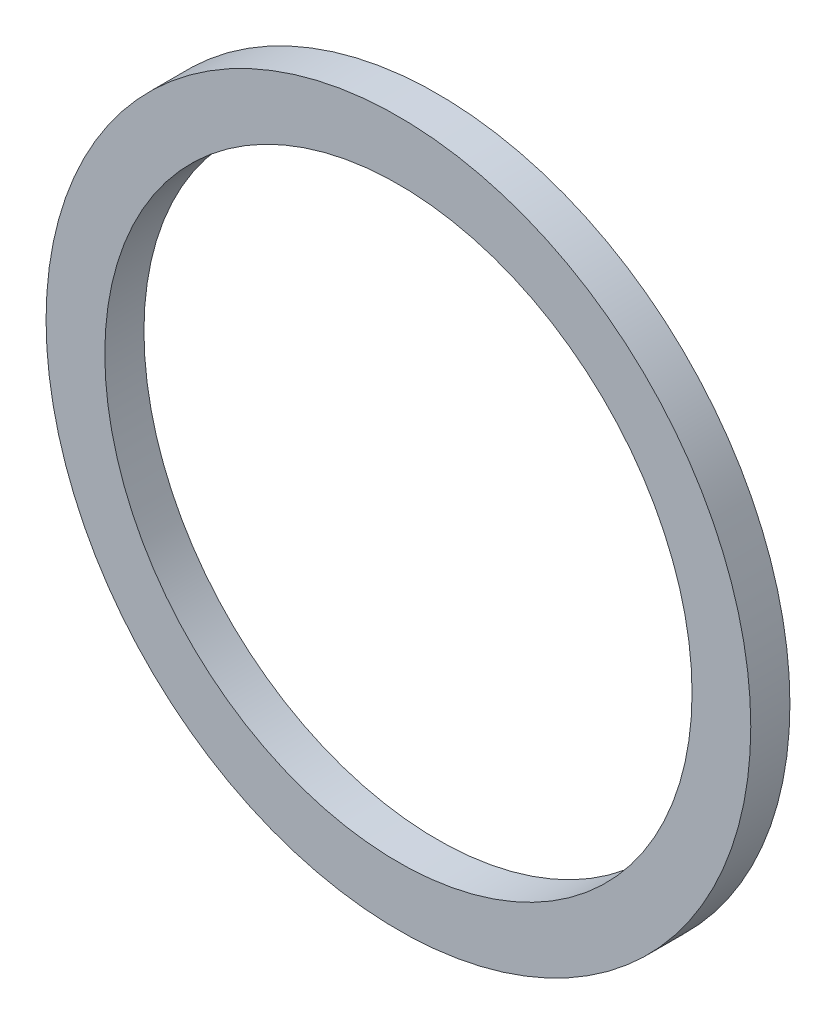
ISO-10303-21;
HEADER;
FILE_DESCRIPTION(('STEP AP214'),'2;1');
FILE_NAME('part.step','',(''),(''),'','','');
FILE_SCHEMA(('AUTOMOTIVE_DESIGN { 1 0 10303 214 1 1 1 1 }'));
ENDSEC;
DATA;
#1=APPLICATION_CONTEXT('core data for automotive mechanical design processes');
#2=APPLICATION_PROTOCOL_DEFINITION('international standard','automotive_design',2000,#1);
#3=PRODUCT_CONTEXT('',#1,'mechanical');
#4=PRODUCT('Part','Part','',(#3));
#5=PRODUCT_RELATED_PRODUCT_CATEGORY('part','',(#4));
#6=PRODUCT_DEFINITION_FORMATION('','',#4);
#7=PRODUCT_DEFINITION_CONTEXT('part definition',#1,'design');
#8=PRODUCT_DEFINITION('design','',#6,#7);
#9=PRODUCT_DEFINITION_SHAPE('','',#8);
#10=(LENGTH_UNIT() NAMED_UNIT(*) SI_UNIT(.MILLI.,.METRE.));
#11=(NAMED_UNIT(*) PLANE_ANGLE_UNIT() SI_UNIT($,.RADIAN.));
#12=(NAMED_UNIT(*) SI_UNIT($,.STERADIAN.) SOLID_ANGLE_UNIT());
#13=UNCERTAINTY_MEASURE_WITH_UNIT(LENGTH_MEASURE(1.E-05),#10,'distance_accuracy_value','');
#14=(GEOMETRIC_REPRESENTATION_CONTEXT(3) GLOBAL_UNCERTAINTY_ASSIGNED_CONTEXT((#13)) GLOBAL_UNIT_ASSIGNED_CONTEXT((#10,
#11,#12)) REPRESENTATION_CONTEXT('',''));
#15=CARTESIAN_POINT('',(0.,0.,0.));
#16=DIRECTION('',(0.,0.,1.));
#17=DIRECTION('',(1.,0.,0.));
#18=AXIS2_PLACEMENT_3D('',#15,#16,#17);
#19=CARTESIAN_POINT('',(0.,0.,0.2));
#20=DIRECTION('',(0.,0.,1.));
#21=DIRECTION('',(1.,0.,0.));
#22=AXIS2_PLACEMENT_3D('',#19,#20,#21);
#23=PLANE('',#22);
#24=CARTESIAN_POINT('',(0.,0.,0.2));
#25=DIRECTION('',(0.,0.,1.));
#26=DIRECTION('',(1.,0.,0.));
#27=AXIS2_PLACEMENT_3D('',#24,#25,#26);
#28=CIRCLE('',#27,1.8);
#29=CARTESIAN_POINT('',(1.8,0.,0.2));
#30=VERTEX_POINT('',#29);
#31=EDGE_CURVE('E10',#30,#30,#28,.T.);
#32=ORIENTED_EDGE('',*,*,#31,.T.);
#33=EDGE_LOOP('',(#32));
#34=FACE_BOUND('',#33,.T.);
#35=CARTESIAN_POINT('',(0.,0.,0.2));
#36=DIRECTION('',(0.,0.,1.));
#37=DIRECTION('',(1.,0.,0.));
#38=AXIS2_PLACEMENT_3D('',#35,#36,#37);
#39=CIRCLE('',#38,1.5);
#40=CARTESIAN_POINT('',(1.5,0.,0.2));
#41=VERTEX_POINT('',#40);
#42=EDGE_CURVE('E43',#41,#41,#39,.T.);
#43=ORIENTED_EDGE('',*,*,#42,.F.);
#44=EDGE_LOOP('',(#43));
#45=FACE_BOUND('',#44,.T.);
#46=ADVANCED_FACE('F32',(#34,#45),#23,.T.);
#47=CARTESIAN_POINT('',(0.,0.,0.));
#48=DIRECTION('',(0.,0.,1.));
#49=DIRECTION('',(1.,0.,0.));
#50=AXIS2_PLACEMENT_3D('',#47,#48,#49);
#51=PLANE('',#50);
#52=CARTESIAN_POINT('',(0.,0.,0.));
#53=DIRECTION('',(0.,0.,1.));
#54=DIRECTION('',(1.,0.,0.));
#55=AXIS2_PLACEMENT_3D('',#52,#53,#54);
#56=CIRCLE('',#55,1.8);
#57=CARTESIAN_POINT('',(1.8,0.,0.));
#58=VERTEX_POINT('',#57);
#59=EDGE_CURVE('E36',#58,#58,#56,.T.);
#60=ORIENTED_EDGE('',*,*,#59,.F.);
#61=EDGE_LOOP('',(#60));
#62=FACE_BOUND('',#61,.T.);
#63=CARTESIAN_POINT('',(0.,0.,0.));
#64=DIRECTION('',(0.,0.,1.));
#65=DIRECTION('',(1.,0.,0.));
#66=AXIS2_PLACEMENT_3D('',#63,#64,#65);
#67=CIRCLE('',#66,1.5);
#68=CARTESIAN_POINT('',(1.5,0.,0.));
#69=VERTEX_POINT('',#68);
#70=EDGE_CURVE('E45',#69,#69,#67,.T.);
#71=ORIENTED_EDGE('',*,*,#70,.T.);
#72=EDGE_LOOP('',(#71));
#73=FACE_BOUND('',#72,.T.);
#74=ADVANCED_FACE('F55',(#62,#73),#51,.F.);
#75=CARTESIAN_POINT('',(0.,0.,0.2));
#76=DIRECTION('',(0.,0.,-1.));
#77=DIRECTION('',(-1.,0.,0.));
#78=AXIS2_PLACEMENT_3D('',#75,#76,#77);
#79=CYLINDRICAL_SURFACE('',#78,1.8);
#80=ORIENTED_EDGE('',*,*,#31,.F.);
#81=EDGE_LOOP('',(#80));
#82=FACE_BOUND('',#81,.T.);
#83=ORIENTED_EDGE('',*,*,#59,.T.);
#84=EDGE_LOOP('',(#83));
#85=FACE_BOUND('',#84,.T.);
#86=ADVANCED_FACE('F34',(#82,#85),#79,.T.);
#87=CARTESIAN_POINT('',(0.,0.,0.2));
#88=DIRECTION('',(0.,0.,-1.));
#89=DIRECTION('',(-1.,0.,0.));
#90=AXIS2_PLACEMENT_3D('',#87,#88,#89);
#91=CYLINDRICAL_SURFACE('',#90,1.5);
#92=ORIENTED_EDGE('',*,*,#42,.T.);
#93=EDGE_LOOP('',(#92));
#94=FACE_BOUND('',#93,.T.);
#95=ORIENTED_EDGE('',*,*,#70,.F.);
#96=EDGE_LOOP('',(#95));
#97=FACE_BOUND('',#96,.T.);
#98=ADVANCED_FACE('F51',(#94,#97),#91,.F.);
#99=CLOSED_SHELL('',(#46,#74,#86,#98));
#100=MANIFOLD_SOLID_BREP('B2',#99);
#101=ADVANCED_BREP_SHAPE_REPRESENTATION('',(#18,#100),#14);
#102=SHAPE_DEFINITION_REPRESENTATION(#9,#101);
ENDSEC;
END-ISO-10303-21;
